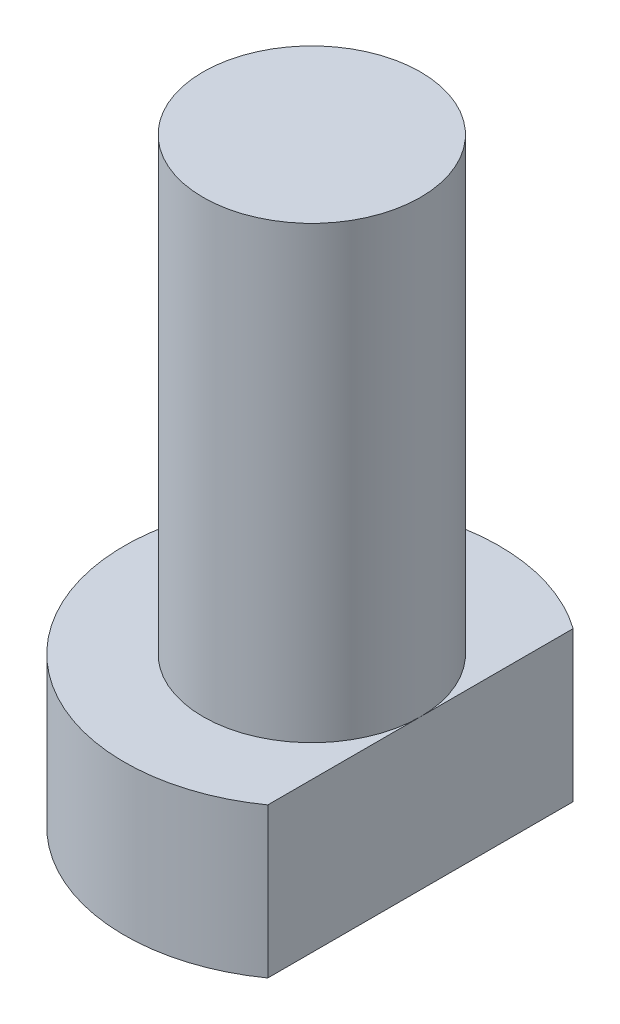
ISO-10303-21;
HEADER;
FILE_DESCRIPTION(('STEP AP214'),'2;1');
FILE_NAME('part.step','',(''),(''),'','','');
FILE_SCHEMA(('AUTOMOTIVE_DESIGN { 1 0 10303 214 1 1 1 1 }'));
ENDSEC;
DATA;
#1=APPLICATION_CONTEXT('core data for automotive mechanical design processes');
#2=APPLICATION_PROTOCOL_DEFINITION('international standard','automotive_design',2000,#1);
#3=PRODUCT_CONTEXT('',#1,'mechanical');
#4=PRODUCT('Part','Part','',(#3));
#5=PRODUCT_RELATED_PRODUCT_CATEGORY('part','',(#4));
#6=PRODUCT_DEFINITION_FORMATION('','',#4);
#7=PRODUCT_DEFINITION_CONTEXT('part definition',#1,'design');
#8=PRODUCT_DEFINITION('design','',#6,#7);
#9=PRODUCT_DEFINITION_SHAPE('','',#8);
#10=(LENGTH_UNIT() NAMED_UNIT(*) SI_UNIT(.MILLI.,.METRE.));
#11=(NAMED_UNIT(*) PLANE_ANGLE_UNIT() SI_UNIT($,.RADIAN.));
#12=(NAMED_UNIT(*) SI_UNIT($,.STERADIAN.) SOLID_ANGLE_UNIT());
#13=UNCERTAINTY_MEASURE_WITH_UNIT(LENGTH_MEASURE(1.E-05),#10,'distance_accuracy_value','');
#14=(GEOMETRIC_REPRESENTATION_CONTEXT(3) GLOBAL_UNCERTAINTY_ASSIGNED_CONTEXT((#13)) GLOBAL_UNIT_ASSIGNED_CONTEXT((#10,
#11,#12)) REPRESENTATION_CONTEXT('',''));
#15=CARTESIAN_POINT('',(0.,0.,0.));
#16=DIRECTION('',(0.,0.,1.));
#17=DIRECTION('',(1.,0.,0.));
#18=AXIS2_PLACEMENT_3D('',#15,#16,#17);
#19=CARTESIAN_POINT('',(0.,2.,0.));
#20=DIRECTION('',(0.,-1.,0.));
#21=DIRECTION('',(0.,0.,-1.));
#22=AXIS2_PLACEMENT_3D('',#19,#20,#21);
#23=CYLINDRICAL_SURFACE('',#22,2.5);
#24=CARTESIAN_POINT('',(0.,2.,0.));
#25=DIRECTION('',(0.,1.,0.));
#26=DIRECTION('',(0.,0.,1.));
#27=AXIS2_PLACEMENT_3D('',#24,#25,#26);
#28=CIRCLE('',#27,2.5);
#29=CARTESIAN_POINT('',(1.45,2.,-2.03654118544163));
#30=VERTEX_POINT('',#29);
#31=CARTESIAN_POINT('',(1.45,2.,2.03654118544163));
#32=VERTEX_POINT('',#31);
#33=EDGE_CURVE('E79',#30,#32,#28,.T.);
#34=ORIENTED_EDGE('',*,*,#33,.F.);
#35=DIRECTION('',(0.,1.,0.));
#36=VECTOR('',#35,1.);
#37=CARTESIAN_POINT('',(1.45,-4.,-2.03654118544163));
#38=LINE('',#37,#36);
#39=CARTESIAN_POINT('',(1.45,0.,-2.03654118544163));
#40=VERTEX_POINT('',#39);
#41=EDGE_CURVE('E65',#40,#30,#38,.T.);
#42=ORIENTED_EDGE('',*,*,#41,.F.);
#43=CARTESIAN_POINT('',(0.,0.,0.));
#44=DIRECTION('',(0.,1.,0.));
#45=DIRECTION('',(0.,0.,1.));
#46=AXIS2_PLACEMENT_3D('',#43,#44,#45);
#47=CIRCLE('',#46,2.5);
#48=CARTESIAN_POINT('',(1.45,0.,2.03654118544163));
#49=VERTEX_POINT('',#48);
#50=EDGE_CURVE('E83',#40,#49,#47,.T.);
#51=ORIENTED_EDGE('',*,*,#50,.T.);
#52=DIRECTION('',(0.,1.,0.));
#53=VECTOR('',#52,1.);
#54=CARTESIAN_POINT('',(1.45,-4.,2.03654118544163));
#55=LINE('',#54,#53);
#56=EDGE_CURVE('E55',#49,#32,#55,.T.);
#57=ORIENTED_EDGE('',*,*,#56,.T.);
#58=EDGE_LOOP('',(#34,#42,#51,#57));
#59=FACE_BOUND('',#58,.T.);
#60=ADVANCED_FACE('F41',(#59),#23,.T.);
#61=CARTESIAN_POINT('',(0.,2.,0.));
#62=DIRECTION('',(0.,1.,0.));
#63=DIRECTION('',(0.,0.,1.));
#64=AXIS2_PLACEMENT_3D('',#61,#62,#63);
#65=PLANE('',#64);
#66=DIRECTION('',(0.,0.,1.));
#67=VECTOR('',#66,1.);
#68=CARTESIAN_POINT('',(1.45,2.,-2.03654118544163));
#69=LINE('',#68,#67);
#70=CARTESIAN_POINT('',(1.45,2.,0.));
#71=VERTEX_POINT('',#70);
#72=EDGE_CURVE('E68',#30,#71,#69,.T.);
#73=ORIENTED_EDGE('',*,*,#72,.F.);
#74=ORIENTED_EDGE('',*,*,#33,.T.);
#75=EDGE_CURVE('E81',#71,#32,#69,.T.);
#76=ORIENTED_EDGE('',*,*,#75,.F.);
#77=CARTESIAN_POINT('',(0.,2.,0.));
#78=DIRECTION('',(0.,1.,0.));
#79=DIRECTION('',(0.,0.,1.));
#80=AXIS2_PLACEMENT_3D('',#77,#78,#79);
#81=CIRCLE('',#80,1.45);
#82=EDGE_CURVE('E48',#71,#71,#81,.T.);
#83=ORIENTED_EDGE('',*,*,#82,.F.);
#84=EDGE_LOOP('',(#73,#74,#76,#83));
#85=FACE_BOUND('',#84,.T.);
#86=ADVANCED_FACE('F78',(#85),#65,.T.);
#87=CARTESIAN_POINT('',(0.,0.,0.));
#88=DIRECTION('',(0.,1.,0.));
#89=DIRECTION('',(0.,0.,1.));
#90=AXIS2_PLACEMENT_3D('',#87,#88,#89);
#91=PLANE('',#90);
#92=ORIENTED_EDGE('',*,*,#50,.F.);
#93=DIRECTION('',(0.,0.,1.));
#94=VECTOR('',#93,1.);
#95=CARTESIAN_POINT('',(1.45,0.,0.));
#96=LINE('',#95,#94);
#97=EDGE_CURVE('E11',#40,#49,#96,.T.);
#98=ORIENTED_EDGE('',*,*,#97,.T.);
#99=EDGE_LOOP('',(#92,#98));
#100=FACE_BOUND('',#99,.T.);
#101=ADVANCED_FACE('F97',(#100),#91,.F.);
#102=CARTESIAN_POINT('',(0.,8.,0.));
#103=DIRECTION('',(0.,-1.,0.));
#104=DIRECTION('',(0.,0.,-1.));
#105=AXIS2_PLACEMENT_3D('',#102,#103,#104);
#106=CYLINDRICAL_SURFACE('',#105,1.45);
#107=CARTESIAN_POINT('',(0.,8.,0.));
#108=DIRECTION('',(0.,1.,0.));
#109=DIRECTION('',(0.,0.,1.));
#110=AXIS2_PLACEMENT_3D('',#107,#108,#109);
#111=CIRCLE('',#110,1.45);
#112=CARTESIAN_POINT('',(0.,8.,1.45));
#113=VERTEX_POINT('',#112);
#114=EDGE_CURVE('E86',#113,#113,#111,.T.);
#115=ORIENTED_EDGE('',*,*,#114,.F.);
#116=EDGE_LOOP('',(#115));
#117=FACE_BOUND('',#116,.T.);
#118=ORIENTED_EDGE('',*,*,#82,.T.);
#119=EDGE_LOOP('',(#118));
#120=FACE_BOUND('',#119,.T.);
#121=ADVANCED_FACE('F94',(#117,#120),#106,.T.);
#122=CARTESIAN_POINT('',(0.,8.,0.));
#123=DIRECTION('',(0.,1.,0.));
#124=DIRECTION('',(0.,0.,1.));
#125=AXIS2_PLACEMENT_3D('',#122,#123,#124);
#126=PLANE('',#125);
#127=ORIENTED_EDGE('',*,*,#114,.T.);
#128=EDGE_LOOP('',(#127));
#129=FACE_BOUND('',#128,.T.);
#130=ADVANCED_FACE('F92',(#129),#126,.T.);
#131=CARTESIAN_POINT('',(1.45,-4.,-2.03654118544163));
#132=DIRECTION('',(-1.,0.,0.));
#133=DIRECTION('',(0.,0.,1.));
#134=AXIS2_PLACEMENT_3D('',#131,#132,#133);
#135=PLANE('',#134);
#136=ORIENTED_EDGE('',*,*,#41,.T.);
#137=ORIENTED_EDGE('',*,*,#72,.T.);
#138=ORIENTED_EDGE('',*,*,#75,.T.);
#139=ORIENTED_EDGE('',*,*,#56,.F.);
#140=ORIENTED_EDGE('',*,*,#97,.F.);
#141=EDGE_LOOP('',(#136,#137,#138,#139,#140));
#142=FACE_BOUND('',#141,.T.);
#143=ADVANCED_FACE('F67',(#142),#135,.F.);
#144=CLOSED_SHELL('',(#60,#86,#101,#121,#130,#143));
#145=MANIFOLD_SOLID_BREP('B2',#144);
#146=ADVANCED_BREP_SHAPE_REPRESENTATION('',(#18,#145),#14);
#147=SHAPE_DEFINITION_REPRESENTATION(#9,#146);
ENDSEC;
END-ISO-10303-21;
